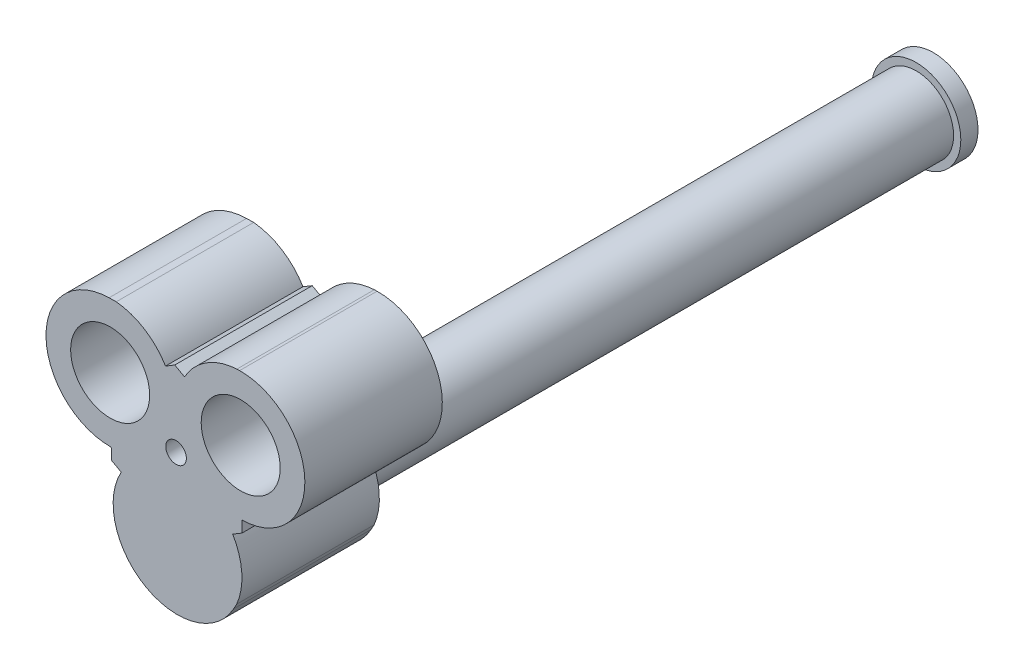
ISO-10303-21;
HEADER;
FILE_DESCRIPTION(('STEP AP214'),'2;1');
FILE_NAME('part.step','',(''),(''),'','','');
FILE_SCHEMA(('AUTOMOTIVE_DESIGN { 1 0 10303 214 1 1 1 1 }'));
ENDSEC;
DATA;
#1=APPLICATION_CONTEXT('core data for automotive mechanical design processes');
#2=APPLICATION_PROTOCOL_DEFINITION('international standard','automotive_design',2000,#1);
#3=PRODUCT_CONTEXT('',#1,'mechanical');
#4=PRODUCT('Part','Part','',(#3));
#5=PRODUCT_RELATED_PRODUCT_CATEGORY('part','',(#4));
#6=PRODUCT_DEFINITION_FORMATION('','',#4);
#7=PRODUCT_DEFINITION_CONTEXT('part definition',#1,'design');
#8=PRODUCT_DEFINITION('design','',#6,#7);
#9=PRODUCT_DEFINITION_SHAPE('','',#8);
#10=(LENGTH_UNIT() NAMED_UNIT(*) SI_UNIT(.MILLI.,.METRE.));
#11=(NAMED_UNIT(*) PLANE_ANGLE_UNIT() SI_UNIT($,.RADIAN.));
#12=(NAMED_UNIT(*) SI_UNIT($,.STERADIAN.) SOLID_ANGLE_UNIT());
#13=UNCERTAINTY_MEASURE_WITH_UNIT(LENGTH_MEASURE(1.E-05),#10,'distance_accuracy_value','');
#14=(GEOMETRIC_REPRESENTATION_CONTEXT(3) GLOBAL_UNCERTAINTY_ASSIGNED_CONTEXT((#13)) GLOBAL_UNIT_ASSIGNED_CONTEXT((#10,
#11,#12)) REPRESENTATION_CONTEXT('',''));
#15=CARTESIAN_POINT('',(0.,0.,0.));
#16=DIRECTION('',(0.,0.,1.));
#17=DIRECTION('',(1.,0.,0.));
#18=AXIS2_PLACEMENT_3D('',#15,#16,#17);
#19=CARTESIAN_POINT('',(0.,0.,2.5));
#20=DIRECTION('',(0.,0.,1.));
#21=DIRECTION('',(1.,0.,0.));
#22=AXIS2_PLACEMENT_3D('',#19,#20,#21);
#23=CYLINDRICAL_SURFACE('',#22,5.45);
#24=CARTESIAN_POINT('',(0.,0.,2.5));
#25=DIRECTION('',(0.,0.,1.));
#26=DIRECTION('',(1.,0.,0.));
#27=AXIS2_PLACEMENT_3D('',#24,#25,#26);
#28=CIRCLE('',#27,5.45);
#29=CARTESIAN_POINT('',(5.45,0.,2.5));
#30=VERTEX_POINT('',#29);
#31=EDGE_CURVE('E231',#30,#30,#28,.T.);
#32=ORIENTED_EDGE('',*,*,#31,.T.);
#33=EDGE_LOOP('',(#32));
#34=FACE_BOUND('',#33,.T.);
#35=CARTESIAN_POINT('',(0.,0.,100.));
#36=DIRECTION('',(0.,0.,1.));
#37=DIRECTION('',(1.,0.,0.));
#38=AXIS2_PLACEMENT_3D('',#35,#36,#37);
#39=CIRCLE('',#38,5.45);
#40=CARTESIAN_POINT('',(5.45,0.,100.));
#41=VERTEX_POINT('',#40);
#42=EDGE_CURVE('E59',#41,#41,#39,.F.);
#43=ORIENTED_EDGE('',*,*,#42,.T.);
#44=EDGE_LOOP('',(#43));
#45=FACE_BOUND('',#44,.T.);
#46=ADVANCED_FACE('F55',(#34,#45),#23,.T.);
#47=CARTESIAN_POINT('',(0.,0.,110.));
#48=DIRECTION('',(0.,0.,-1.));
#49=DIRECTION('',(-1.,0.,0.));
#50=AXIS2_PLACEMENT_3D('',#47,#48,#49);
#51=CYLINDRICAL_SURFACE('',#50,6.5);
#52=CARTESIAN_POINT('',(0.,0.,0.));
#53=DIRECTION('',(0.,0.,1.));
#54=DIRECTION('',(1.,0.,0.));
#55=AXIS2_PLACEMENT_3D('',#52,#53,#54);
#56=CIRCLE('',#55,6.5);
#57=CARTESIAN_POINT('',(6.5,0.,0.));
#58=VERTEX_POINT('',#57);
#59=EDGE_CURVE('E66',#58,#58,#56,.T.);
#60=ORIENTED_EDGE('',*,*,#59,.T.);
#61=EDGE_LOOP('',(#60));
#62=FACE_BOUND('',#61,.T.);
#63=CARTESIAN_POINT('',(0.,0.,2.5));
#64=DIRECTION('',(0.,0.,1.));
#65=DIRECTION('',(1.,0.,0.));
#66=AXIS2_PLACEMENT_3D('',#63,#64,#65);
#67=CIRCLE('',#66,6.5);
#68=CARTESIAN_POINT('',(6.5,0.,2.5));
#69=VERTEX_POINT('',#68);
#70=EDGE_CURVE('E235',#69,#69,#67,.T.);
#71=ORIENTED_EDGE('',*,*,#70,.F.);
#72=EDGE_LOOP('',(#71));
#73=FACE_BOUND('',#72,.T.);
#74=ADVANCED_FACE('F57',(#62,#73),#51,.T.);
#75=CARTESIAN_POINT('',(0.,0.,0.));
#76=DIRECTION('',(0.,0.,1.));
#77=DIRECTION('',(1.,0.,0.));
#78=AXIS2_PLACEMENT_3D('',#75,#76,#77);
#79=PLANE('',#78);
#80=CARTESIAN_POINT('',(0.,0.,0.));
#81=DIRECTION('',(0.,0.,-1.));
#82=DIRECTION('',(-1.,0.,0.));
#83=AXIS2_PLACEMENT_3D('',#80,#81,#82);
#84=CIRCLE('',#83,2.5);
#85=CARTESIAN_POINT('',(-2.5,0.,0.));
#86=VERTEX_POINT('',#85);
#87=EDGE_CURVE('E13',#86,#86,#84,.T.);
#88=ORIENTED_EDGE('',*,*,#87,.F.);
#89=EDGE_LOOP('',(#88));
#90=FACE_BOUND('',#89,.T.);
#91=ORIENTED_EDGE('',*,*,#59,.F.);
#92=EDGE_LOOP('',(#91));
#93=FACE_BOUND('',#92,.T.);
#94=ADVANCED_FACE('F249',(#90,#93),#79,.F.);
#95=CARTESIAN_POINT('',(0.,0.,-2.5));
#96=DIRECTION('',(0.,0.,1.));
#97=DIRECTION('',(1.,0.,0.));
#98=AXIS2_PLACEMENT_3D('',#95,#96,#97);
#99=CYLINDRICAL_SURFACE('',#98,2.5);
#100=CARTESIAN_POINT('',(0.,0.,-2.5));
#101=DIRECTION('',(0.,0.,-1.));
#102=DIRECTION('',(-1.,0.,0.));
#103=AXIS2_PLACEMENT_3D('',#100,#101,#102);
#104=CIRCLE('',#103,2.5);
#105=CARTESIAN_POINT('',(-2.5,0.,-2.5));
#106=VERTEX_POINT('',#105);
#107=EDGE_CURVE('E236',#106,#106,#104,.T.);
#108=ORIENTED_EDGE('',*,*,#107,.F.);
#109=EDGE_LOOP('',(#108));
#110=FACE_BOUND('',#109,.T.);
#111=ORIENTED_EDGE('',*,*,#87,.T.);
#112=EDGE_LOOP('',(#111));
#113=FACE_BOUND('',#112,.T.);
#114=ADVANCED_FACE('F255',(#110,#113),#99,.T.);
#115=CARTESIAN_POINT('',(0.,0.,-2.5));
#116=DIRECTION('',(0.,0.,-1.));
#117=DIRECTION('',(-1.,0.,0.));
#118=AXIS2_PLACEMENT_3D('',#115,#116,#117);
#119=PLANE('',#118);
#120=ORIENTED_EDGE('',*,*,#107,.T.);
#121=EDGE_LOOP('',(#120));
#122=FACE_BOUND('',#121,.T.);
#123=ADVANCED_FACE('F270',(#122),#119,.T.);
#124=CARTESIAN_POINT('',(0.,0.,2.5));
#125=DIRECTION('',(0.,0.,1.));
#126=DIRECTION('',(1.,0.,0.));
#127=AXIS2_PLACEMENT_3D('',#124,#125,#126);
#128=PLANE('',#127);
#129=ORIENTED_EDGE('',*,*,#31,.F.);
#130=EDGE_LOOP('',(#129));
#131=FACE_BOUND('',#130,.T.);
#132=ORIENTED_EDGE('',*,*,#70,.T.);
#133=EDGE_LOOP('',(#132));
#134=FACE_BOUND('',#133,.T.);
#135=ADVANCED_FACE('F246',(#131,#134),#128,.T.);
#136=CARTESIAN_POINT('',(0.,0.,100.));
#137=DIRECTION('',(0.,0.,1.));
#138=DIRECTION('',(1.,0.,0.));
#139=AXIS2_PLACEMENT_3D('',#136,#137,#138);
#140=PLANE('',#139);
#141=ORIENTED_EDGE('',*,*,#42,.F.);
#142=EDGE_LOOP('',(#141));
#143=FACE_BOUND('',#142,.T.);
#144=CARTESIAN_POINT('',(0.,0.,100.));
#145=DIRECTION('',(0.,0.,1.));
#146=DIRECTION('',(1.,0.,0.));
#147=AXIS2_PLACEMENT_3D('',#144,#145,#146);
#148=CIRCLE('',#147,5.75);
#149=CARTESIAN_POINT('',(5.75,0.,100.));
#150=VERTEX_POINT('',#149);
#151=EDGE_CURVE('E226',#150,#150,#148,.T.);
#152=ORIENTED_EDGE('',*,*,#151,.F.);
#153=EDGE_LOOP('',(#152));
#154=FACE_BOUND('',#153,.T.);
#155=ADVANCED_FACE('F266',(#143,#154),#140,.F.);
#156=CARTESIAN_POINT('',(0.,0.,140.));
#157=DIRECTION('',(0.,0.,-1.));
#158=DIRECTION('',(-0.999990132765997,-0.00444233842065457,0.));
#159=AXIS2_PLACEMENT_3D('',#156,#157,#158);
#160=CYLINDRICAL_SURFACE('',#159,5.75);
#161=CARTESIAN_POINT('',(0.,0.,90.));
#162=DIRECTION('',(0.,0.,-1.));
#163=DIRECTION('',(-0.999990132765997,-0.00444233842065457,0.));
#164=AXIS2_PLACEMENT_3D('',#161,#162,#163);
#165=CIRCLE('',#164,5.75);
#166=CARTESIAN_POINT('',(-5.7499432634045,-0.025543445918847,90.));
#167=VERTEX_POINT('',#166);
#168=EDGE_CURVE('E333',#167,#167,#165,.T.);
#169=ORIENTED_EDGE('',*,*,#168,.T.);
#170=EDGE_LOOP('',(#169));
#171=FACE_BOUND('',#170,.T.);
#172=ORIENTED_EDGE('',*,*,#151,.T.);
#173=EDGE_LOOP('',(#172));
#174=FACE_BOUND('',#173,.T.);
#175=ADVANCED_FACE('F505',(#171,#174),#160,.F.);
#176=CARTESIAN_POINT('',(-0.187584514168837,11.0074735096585,90.));
#177=DIRECTION('',(0.,0.,-1.));
#178=DIRECTION('',(-0.999990132765997,-0.00444233842065457,0.));
#179=AXIS2_PLACEMENT_3D('',#176,#177,#178);
#180=PLANE('',#179);
#181=CARTESIAN_POINT('',(-0.187584514168837,11.0074735096585,90.));
#182=DIRECTION('',(0.,0.,-1.));
#183=DIRECTION('',(-0.999990132765997,-0.00444233842065457,0.));
#184=AXIS2_PLACEMENT_3D('',#181,#182,#183);
#185=CIRCLE('',#184,1.5);
#186=CARTESIAN_POINT('',(-1.68756971331783,11.0008100020275,90.));
#187=VERTEX_POINT('',#186);
#188=EDGE_CURVE('E320',#187,#187,#185,.T.);
#189=ORIENTED_EDGE('',*,*,#188,.F.);
#190=EDGE_LOOP('',(#189));
#191=FACE_BOUND('',#190,.T.);
#192=CARTESIAN_POINT('',(9.21825149446411,16.6139651915131,90.));
#193=DIRECTION('',(0.,0.,-1.));
#194=DIRECTION('',(-0.999990132765997,-0.00444233842065457,0.));
#195=AXIS2_PLACEMENT_3D('',#192,#193,#194);
#196=CIRCLE('',#195,5.75000000000001);
#197=CARTESIAN_POINT('',(3.46830823105961,16.5884217455943,90.));
#198=VERTEX_POINT('',#197);
#199=EDGE_CURVE('E374',#198,#198,#196,.T.);
#200=ORIENTED_EDGE('',*,*,#199,.F.);
#201=EDGE_LOOP('',(#200));
#202=FACE_BOUND('',#201,.T.);
#203=CARTESIAN_POINT('',(-9.77899016620873,16.2902225684363,90.));
#204=DIRECTION('',(0.,0.,-1.));
#205=DIRECTION('',(-0.999990132765997,-0.00444233842065457,0.));
#206=AXIS2_PLACEMENT_3D('',#203,#204,#205);
#207=CIRCLE('',#206,5.75);
#208=CARTESIAN_POINT('',(-15.5289334296132,16.2646791225175,90.));
#209=VERTEX_POINT('',#208);
#210=EDGE_CURVE('E380',#209,#209,#207,.T.);
#211=ORIENTED_EDGE('',*,*,#210,.F.);
#212=EDGE_LOOP('',(#211));
#213=FACE_BOUND('',#212,.T.);
#214=ORIENTED_EDGE('',*,*,#168,.F.);
#215=EDGE_LOOP('',(#214));
#216=FACE_BOUND('',#215,.T.);
#217=DIRECTION('',(-0.857380135180861,-0.514683692958353,0.));
#218=VECTOR('',#217,1.);
#219=CARTESIAN_POINT('',(16.6276425636652,9.98154275880603,90.));
#220=LINE('',#219,#218);
#221=CARTESIAN_POINT('',(9.40516438504563,5.64590260486321,90.));
#222=VERTEX_POINT('',#221);
#223=CARTESIAN_POINT('',(8.05384121185663,4.8347058292225,90.));
#224=VERTEX_POINT('',#223);
#225=EDGE_CURVE('E433',#222,#224,#220,.T.);
#226=ORIENTED_EDGE('',*,*,#225,.T.);
#227=CARTESIAN_POINT('',(0.,0.,90.));
#228=DIRECTION('',(0.,0.,-1.));
#229=DIRECTION('',(-0.999990132765997,-0.00444233842065457,0.));
#230=AXIS2_PLACEMENT_3D('',#227,#228,#229);
#231=CIRCLE('',#230,9.3935477174984);
#232=CARTESIAN_POINT('',(8.63896069997515,-3.68877984504425,90.));
#233=VERTEX_POINT('',#232);
#234=EDGE_CURVE('E218',#224,#233,#231,.T.);
#235=ORIENTED_EDGE('',*,*,#234,.T.);
#236=DIRECTION('',(-0.485171131287585,-0.874419220605955,0.));
#237=VECTOR('',#236,1.);
#238=CARTESIAN_POINT('',(8.17036576115139,-4.53332395486946,90.));
#239=LINE('',#238,#237);
#240=CARTESIAN_POINT('',(8.17036576115139,-4.53332395486946,90.));
#241=VERTEX_POINT('',#240);
#242=EDGE_CURVE('E213',#233,#241,#239,.T.);
#243=ORIENTED_EDGE('',*,*,#242,.T.);
#244=CARTESIAN_POINT('',(0.,0.,90.));
#245=DIRECTION('',(0.,0.,-1.));
#246=DIRECTION('',(-0.999990132765997,-0.00444233842065457,0.));
#247=AXIS2_PLACEMENT_3D('',#244,#245,#246);
#248=CIRCLE('',#247,9.34376277260867);
#249=CARTESIAN_POINT('',(-8.17036576115142,4.53332395486929,90.));
#250=VERTEX_POINT('',#249);
#251=EDGE_CURVE('E217',#241,#250,#248,.T.);
#252=ORIENTED_EDGE('',*,*,#251,.T.);
#253=DIRECTION('',(-0.874419220605955,0.485171131287585,0.));
#254=VECTOR('',#253,1.);
#255=CARTESIAN_POINT('',(-8.17036576115142,4.53332395486929,90.));
#256=LINE('',#255,#254);
#257=CARTESIAN_POINT('',(-9.5920772756272,5.32215998178645,90.));
#258=VERTEX_POINT('',#257);
#259=EDGE_CURVE('E222',#250,#258,#256,.T.);
#260=ORIENTED_EDGE('',*,*,#259,.T.);
#261=DIRECTION('',(-0.0170390854250929,0.999854824245939,0.));
#262=VECTOR('',#261,1.);
#263=CARTESIAN_POINT('',(-9.44953421128947,-3.04227783780403,90.));
#264=LINE('',#263,#262);
#265=CARTESIAN_POINT('',(-9.6199250655404,6.95627040465536,90.));
#266=VERTEX_POINT('',#265);
#267=EDGE_CURVE('E192',#258,#266,#264,.T.);
#268=ORIENTED_EDGE('',*,*,#267,.T.);
#269=CARTESIAN_POINT('',(-9.77899016620873,16.2902225684363,90.));
#270=DIRECTION('',(0.,0.,-1.));
#271=DIRECTION('',(-0.999990132765997,-0.00444233842065457,0.));
#272=AXIS2_PLACEMENT_3D('',#269,#270,#271);
#273=CIRCLE('',#272,9.33530742407561);
#274=CARTESIAN_POINT('',(-9.93805526687705,25.6241747322172,90.));
#275=VERTEX_POINT('',#274);
#276=EDGE_CURVE('E187',#266,#275,#273,.T.);
#277=ORIENTED_EDGE('',*,*,#276,.T.);
#278=DIRECTION('',(0.999854824245939,0.0170390854250931,0.));
#279=VECTOR('',#278,1.);
#280=CARTESIAN_POINT('',(9.05918639379577,25.947917355294,90.));
#281=LINE('',#280,#279);
#282=CARTESIAN_POINT('',(-8.89380561567961,25.6419703747249,90.));
#283=VERTEX_POINT('',#282);
#284=EDGE_CURVE('E164',#275,#283,#281,.T.);
#285=ORIENTED_EDGE('',*,*,#284,.T.);
#286=CARTESIAN_POINT('',(-9.77899016620873,16.2902225684363,90.));
#287=DIRECTION('',(0.,0.,-1.));
#288=DIRECTION('',(-0.999990132765997,-0.00444233842065457,0.));
#289=AXIS2_PLACEMENT_3D('',#286,#287,#288);
#290=CIRCLE('',#289,9.3935477174984);
#291=CARTESIAN_POINT('',(-1.72514895435207,21.1249283976589,90.));
#292=VERTEX_POINT('',#291);
#293=EDGE_CURVE('E174',#283,#292,#290,.T.);
#294=ORIENTED_EDGE('',*,*,#293,.T.);
#295=DIRECTION('',(0.857380135180862,0.514683692958352,0.));
#296=VECTOR('',#295,1.);
#297=CARTESIAN_POINT('',(-1.72514895435207,21.1249283976589,90.));
#298=LINE('',#297,#296);
#299=CARTESIAN_POINT('',(-0.373825781163064,21.9361251732996,90.));
#300=VERTEX_POINT('',#299);
#301=EDGE_CURVE('E182',#292,#300,#298,.T.);
#302=ORIENTED_EDGE('',*,*,#301,.T.);
#303=DIRECTION('',(0.874419220605955,-0.485171131287584,0.));
#304=VECTOR('',#303,1.);
#305=CARTESIAN_POINT('',(-7.69630647274685,25.9990004592583,90.));
#306=LINE('',#305,#304);
#307=CARTESIAN_POINT('',(1.0478857333127,21.1472891463824,90.));
#308=VERTEX_POINT('',#307);
#309=EDGE_CURVE('E205',#300,#308,#306,.T.);
#310=ORIENTED_EDGE('',*,*,#309,.T.);
#311=CARTESIAN_POINT('',(9.2182514944641,16.613965191513,90.));
#312=DIRECTION('',(0.,0.,-1.));
#313=DIRECTION('',(-0.999990132765997,-0.00444233842065457,0.));
#314=AXIS2_PLACEMENT_3D('',#311,#312,#313);
#315=CIRCLE('',#314,9.34376277260867);
#316=CARTESIAN_POINT('',(8.66182988565164,25.941145780739,90.));
#317=VERTEX_POINT('',#316);
#318=EDGE_CURVE('E198',#308,#317,#315,.T.);
#319=ORIENTED_EDGE('',*,*,#318,.T.);
#320=CARTESIAN_POINT('',(9.05918639379577,25.947917355294,90.));
#321=VERTEX_POINT('',#320);
#322=EDGE_CURVE('E190',#317,#321,#281,.T.);
#323=ORIENTED_EDGE('',*,*,#322,.T.);
#324=CARTESIAN_POINT('',(9.2182514944641,16.613965191513,90.));
#325=DIRECTION('',(0.,0.,-1.));
#326=DIRECTION('',(-0.999990132765997,-0.00444233842065457,0.));
#327=AXIS2_PLACEMENT_3D('',#324,#325,#326);
#328=CIRCLE('',#327,9.33530742407561);
#329=CARTESIAN_POINT('',(9.37731659513243,7.28001302773213,90.));
#330=VERTEX_POINT('',#329);
#331=EDGE_CURVE('E197',#321,#330,#328,.T.);
#332=ORIENTED_EDGE('',*,*,#331,.T.);
#333=DIRECTION('',(0.0170390854250929,-0.999854824245939,0.));
#334=VECTOR('',#333,1.);
#335=CARTESIAN_POINT('',(9.37731659513243,7.28001302773213,90.));
#336=LINE('',#335,#334);
#337=EDGE_CURVE('E204',#330,#222,#336,.T.);
#338=ORIENTED_EDGE('',*,*,#337,.T.);
#339=EDGE_LOOP('',(#226,#235,#243,#252,#260,#268,#277,#285,#294,#302,#310,#319,#323,#332,#338));
#340=FACE_BOUND('',#339,.T.);
#341=ADVANCED_FACE('F185',(#191,#202,#213,#216,#340),#180,.T.);
#342=CARTESIAN_POINT('',(9.21825149446411,16.6139651915131,140.));
#343=DIRECTION('',(0.,0.,-1.));
#344=DIRECTION('',(-0.999990132765997,-0.00444233842065457,0.));
#345=AXIS2_PLACEMENT_3D('',#342,#343,#344);
#346=CYLINDRICAL_SURFACE('',#345,5.75000000000001);
#347=ORIENTED_EDGE('',*,*,#199,.T.);
#348=EDGE_LOOP('',(#347));
#349=FACE_BOUND('',#348,.T.);
#350=CARTESIAN_POINT('',(9.21825149446411,16.6139651915131,110.));
#351=DIRECTION('',(0.,0.,-1.));
#352=DIRECTION('',(-0.999990132765997,-0.00444233842065457,0.));
#353=AXIS2_PLACEMENT_3D('',#350,#351,#352);
#354=CIRCLE('',#353,5.75000000000001);
#355=CARTESIAN_POINT('',(3.46830823105961,16.5884217455943,110.));
#356=VERTEX_POINT('',#355);
#357=EDGE_CURVE('E295',#356,#356,#354,.T.);
#358=ORIENTED_EDGE('',*,*,#357,.F.);
#359=EDGE_LOOP('',(#358));
#360=FACE_BOUND('',#359,.T.);
#361=ADVANCED_FACE('F504',(#349,#360),#346,.F.);
#362=CARTESIAN_POINT('',(-9.77899016620873,16.2902225684363,140.));
#363=DIRECTION('',(0.,0.,-1.));
#364=DIRECTION('',(-0.999990132765997,-0.00444233842065457,0.));
#365=AXIS2_PLACEMENT_3D('',#362,#363,#364);
#366=CYLINDRICAL_SURFACE('',#365,5.75);
#367=ORIENTED_EDGE('',*,*,#210,.T.);
#368=EDGE_LOOP('',(#367));
#369=FACE_BOUND('',#368,.T.);
#370=CARTESIAN_POINT('',(-9.77899016620873,16.2902225684363,110.));
#371=DIRECTION('',(0.,0.,-1.));
#372=DIRECTION('',(-0.999990132765997,-0.00444233842065457,0.));
#373=AXIS2_PLACEMENT_3D('',#370,#371,#372);
#374=CIRCLE('',#373,5.75);
#375=CARTESIAN_POINT('',(-15.5289334296132,16.2646791225175,110.));
#376=VERTEX_POINT('',#375);
#377=EDGE_CURVE('E299',#376,#376,#374,.T.);
#378=ORIENTED_EDGE('',*,*,#377,.F.);
#379=EDGE_LOOP('',(#378));
#380=FACE_BOUND('',#379,.T.);
#381=ADVANCED_FACE('F494',(#369,#380),#366,.F.);
#382=CARTESIAN_POINT('',(-8.17036576115142,4.53332395486929,140.));
#383=DIRECTION('',(-0.485171131287585,-0.874419220605955,0.));
#384=DIRECTION('',(-0.874419220605955,0.485171131287585,0.));
#385=AXIS2_PLACEMENT_3D('',#382,#383,#384);
#386=PLANE('',#385);
#387=DIRECTION('',(-0.874419220605955,0.485171131287585,0.));
#388=VECTOR('',#387,1.);
#389=CARTESIAN_POINT('',(-4.81327197396652,2.67064190010119,110.));
#390=LINE('',#389,#388);
#391=CARTESIAN_POINT('',(-8.17036576115142,4.53332395486929,110.));
#392=VERTEX_POINT('',#391);
#393=CARTESIAN_POINT('',(-9.5920772756272,5.32215998178644,110.));
#394=VERTEX_POINT('',#393);
#395=EDGE_CURVE('E328',#392,#394,#390,.T.);
#396=ORIENTED_EDGE('',*,*,#395,.T.);
#397=DIRECTION('',(0.,0.,1.));
#398=VECTOR('',#397,1.);
#399=CARTESIAN_POINT('',(-9.5920772756272,5.32215998178644,140.));
#400=LINE('',#399,#398);
#401=EDGE_CURVE('E230',#258,#394,#400,.T.);
#402=ORIENTED_EDGE('',*,*,#401,.F.);
#403=ORIENTED_EDGE('',*,*,#259,.F.);
#404=DIRECTION('',(0.,0.,-1.));
#405=VECTOR('',#404,1.);
#406=CARTESIAN_POINT('',(-8.17036576115142,4.53332395486929,140.));
#407=LINE('',#406,#405);
#408=EDGE_CURVE('E324',#392,#250,#407,.T.);
#409=ORIENTED_EDGE('',*,*,#408,.F.);
#410=EDGE_LOOP('',(#396,#402,#403,#409));
#411=FACE_BOUND('',#410,.T.);
#412=ADVANCED_FACE('F490',(#411),#386,.T.);
#413=CARTESIAN_POINT('',(0.,0.,140.));
#414=DIRECTION('',(0.,0.,-1.));
#415=DIRECTION('',(-0.999990132765997,-0.00444233842065457,0.));
#416=AXIS2_PLACEMENT_3D('',#413,#414,#415);
#417=CYLINDRICAL_SURFACE('',#416,9.34376277260867);
#418=CARTESIAN_POINT('',(0.,0.,110.));
#419=DIRECTION('',(0.,0.,-1.));
#420=DIRECTION('',(-0.999990132765997,-0.00444233842065457,0.));
#421=AXIS2_PLACEMENT_3D('',#418,#419,#420);
#422=CIRCLE('',#421,9.34376277260867);
#423=CARTESIAN_POINT('',(8.17036576115139,-4.53332395486946,110.));
#424=VERTEX_POINT('',#423);
#425=EDGE_CURVE('E325',#424,#392,#422,.T.);
#426=ORIENTED_EDGE('',*,*,#425,.T.);
#427=ORIENTED_EDGE('',*,*,#408,.T.);
#428=ORIENTED_EDGE('',*,*,#251,.F.);
#429=DIRECTION('',(0.,0.,-1.));
#430=VECTOR('',#429,1.);
#431=CARTESIAN_POINT('',(8.17036576115139,-4.53332395486946,140.));
#432=LINE('',#431,#430);
#433=EDGE_CURVE('E120',#424,#241,#432,.T.);
#434=ORIENTED_EDGE('',*,*,#433,.F.);
#435=EDGE_LOOP('',(#426,#427,#428,#434));
#436=FACE_BOUND('',#435,.T.);
#437=ADVANCED_FACE('F493',(#436),#417,.T.);
#438=CARTESIAN_POINT('',(8.17036576115139,-4.53332395486946,140.));
#439=DIRECTION('',(0.874419220605955,-0.485171131287585,0.));
#440=DIRECTION('',(-0.485171131287585,-0.874419220605955,0.));
#441=AXIS2_PLACEMENT_3D('',#438,#439,#440);
#442=PLANE('',#441);
#443=DIRECTION('',(-0.485171131287585,-0.874419220605955,0.));
#444=VECTOR('',#443,1.);
#445=CARTESIAN_POINT('',(12.7960532209491,3.80350765468788,110.));
#446=LINE('',#445,#444);
#447=CARTESIAN_POINT('',(8.63896069997518,-3.68877984504418,110.));
#448=VERTEX_POINT('',#447);
#449=EDGE_CURVE('E127',#448,#424,#446,.T.);
#450=ORIENTED_EDGE('',*,*,#449,.T.);
#451=ORIENTED_EDGE('',*,*,#433,.T.);
#452=ORIENTED_EDGE('',*,*,#242,.F.);
#453=DIRECTION('',(0.,0.,-1.));
#454=VECTOR('',#453,1.);
#455=CARTESIAN_POINT('',(8.63896069997518,-3.68877984504418,140.));
#456=LINE('',#455,#454);
#457=EDGE_CURVE('E310',#448,#233,#456,.T.);
#458=ORIENTED_EDGE('',*,*,#457,.F.);
#459=EDGE_LOOP('',(#450,#451,#452,#458));
#460=FACE_BOUND('',#459,.T.);
#461=ADVANCED_FACE('F488',(#460),#442,.T.);
#462=CARTESIAN_POINT('',(16.6276425636652,9.98154275880603,140.));
#463=DIRECTION('',(0.514683692958353,-0.857380135180861,0.));
#464=DIRECTION('',(-0.857380135180861,-0.514683692958353,0.));
#465=AXIS2_PLACEMENT_3D('',#462,#463,#464);
#466=PLANE('',#465);
#467=DIRECTION('',(-0.857380135180861,-0.514683692958353,0.));
#468=VECTOR('',#467,1.);
#469=CARTESIAN_POINT('',(4.71947971688209,2.83309485472795,110.));
#470=LINE('',#469,#468);
#471=CARTESIAN_POINT('',(9.40516438504563,5.64590260486321,110.));
#472=VERTEX_POINT('',#471);
#473=CARTESIAN_POINT('',(8.05384121185663,4.8347058292225,110.));
#474=VERTEX_POINT('',#473);
#475=EDGE_CURVE('E305',#472,#474,#470,.T.);
#476=ORIENTED_EDGE('',*,*,#475,.T.);
#477=DIRECTION('',(0.,0.,-1.));
#478=VECTOR('',#477,1.);
#479=CARTESIAN_POINT('',(8.05384121185663,4.8347058292225,140.));
#480=LINE('',#479,#478);
#481=EDGE_CURVE('E311',#474,#224,#480,.T.);
#482=ORIENTED_EDGE('',*,*,#481,.T.);
#483=ORIENTED_EDGE('',*,*,#225,.F.);
#484=DIRECTION('',(0.,0.,-1.));
#485=VECTOR('',#484,1.);
#486=CARTESIAN_POINT('',(9.40516438504563,5.64590260486321,140.));
#487=LINE('',#486,#485);
#488=EDGE_CURVE('E339',#472,#222,#487,.T.);
#489=ORIENTED_EDGE('',*,*,#488,.F.);
#490=EDGE_LOOP('',(#476,#482,#483,#489));
#491=FACE_BOUND('',#490,.T.);
#492=ADVANCED_FACE('F485',(#491),#466,.T.);
#493=CARTESIAN_POINT('',(0.,0.,140.));
#494=DIRECTION('',(0.,0.,-1.));
#495=DIRECTION('',(-0.999990132765997,-0.00444233842065457,0.));
#496=AXIS2_PLACEMENT_3D('',#493,#494,#495);
#497=CYLINDRICAL_SURFACE('',#496,9.3935477174984);
#498=CARTESIAN_POINT('',(0.,0.,110.));
#499=DIRECTION('',(0.,0.,-1.));
#500=DIRECTION('',(-0.999990132765997,-0.00444233842065457,0.));
#501=AXIS2_PLACEMENT_3D('',#498,#499,#500);
#502=CIRCLE('',#501,9.3935477174984);
#503=EDGE_CURVE('E303',#474,#448,#502,.T.);
#504=ORIENTED_EDGE('',*,*,#503,.T.);
#505=ORIENTED_EDGE('',*,*,#457,.T.);
#506=ORIENTED_EDGE('',*,*,#234,.F.);
#507=ORIENTED_EDGE('',*,*,#481,.F.);
#508=EDGE_LOOP('',(#504,#505,#506,#507));
#509=FACE_BOUND('',#508,.T.);
#510=ADVANCED_FACE('F482',(#509),#497,.T.);
#511=CARTESIAN_POINT('',(9.2182514944641,16.613965191513,140.));
#512=DIRECTION('',(0.,0.,-1.));
#513=DIRECTION('',(-0.999990132765997,-0.00444233842065457,0.));
#514=AXIS2_PLACEMENT_3D('',#511,#512,#513);
#515=CYLINDRICAL_SURFACE('',#514,9.33530742407561);
#516=CARTESIAN_POINT('',(9.2182514944641,16.613965191513,110.));
#517=DIRECTION('',(0.,0.,-1.));
#518=DIRECTION('',(-0.999990132765997,-0.00444233842065457,0.));
#519=AXIS2_PLACEMENT_3D('',#516,#517,#518);
#520=CIRCLE('',#519,9.33530742407561);
#521=CARTESIAN_POINT('',(9.05918639379577,25.947917355294,110.));
#522=VERTEX_POINT('',#521);
#523=CARTESIAN_POINT('',(9.37731659513243,7.28001302773213,110.));
#524=VERTEX_POINT('',#523);
#525=EDGE_CURVE('E315',#522,#524,#520,.T.);
#526=ORIENTED_EDGE('',*,*,#525,.T.);
#527=DIRECTION('',(0.,0.,-1.));
#528=VECTOR('',#527,1.);
#529=CARTESIAN_POINT('',(9.37731659513243,7.28001302773213,140.));
#530=LINE('',#529,#528);
#531=EDGE_CURVE('E340',#524,#330,#530,.T.);
#532=ORIENTED_EDGE('',*,*,#531,.T.);
#533=ORIENTED_EDGE('',*,*,#331,.F.);
#534=DIRECTION('',(0.,0.,-1.));
#535=VECTOR('',#534,1.);
#536=CARTESIAN_POINT('',(9.05918639379577,25.947917355294,140.));
#537=LINE('',#536,#535);
#538=EDGE_CURVE('E356',#522,#321,#537,.T.);
#539=ORIENTED_EDGE('',*,*,#538,.F.);
#540=EDGE_LOOP('',(#526,#532,#533,#539));
#541=FACE_BOUND('',#540,.T.);
#542=ADVANCED_FACE('F413',(#541),#515,.T.);
#543=CARTESIAN_POINT('',(9.37731659513243,7.28001302773213,140.));
#544=DIRECTION('',(0.999854824245939,0.0170390854250929,0.));
#545=DIRECTION('',(0.0170390854250929,-0.999854824245939,0.));
#546=AXIS2_PLACEMENT_3D('',#543,#544,#545);
#547=PLANE('',#546);
#548=DIRECTION('',(0.0170390854250929,-0.999854824245939,0.));
#549=VECTOR('',#548,1.);
#550=CARTESIAN_POINT('',(9.31103631616758,11.1693448211969,110.));
#551=LINE('',#550,#549);
#552=EDGE_CURVE('E336',#524,#472,#551,.T.);
#553=ORIENTED_EDGE('',*,*,#552,.T.);
#554=ORIENTED_EDGE('',*,*,#488,.T.);
#555=ORIENTED_EDGE('',*,*,#337,.F.);
#556=ORIENTED_EDGE('',*,*,#531,.F.);
#557=EDGE_LOOP('',(#553,#554,#555,#556));
#558=FACE_BOUND('',#557,.T.);
#559=ADVANCED_FACE('F418',(#558),#547,.T.);
#560=CARTESIAN_POINT('',(-7.69630647274685,25.9990004592583,140.));
#561=DIRECTION('',(0.485171131287584,0.874419220605955,0.));
#562=DIRECTION('',(0.874419220605955,-0.485171131287584,0.));
#563=AXIS2_PLACEMENT_3D('',#560,#561,#562);
#564=PLANE('',#563);
#565=DIRECTION('',(0.874419220605955,-0.485171131287584,0.));
#566=VECTOR('',#565,1.);
#567=CARTESIAN_POINT('',(4.40497952049759,19.2846070916143,110.));
#568=LINE('',#567,#566);
#569=CARTESIAN_POINT('',(-0.373825781163063,21.9361251732996,110.));
#570=VERTEX_POINT('',#569);
#571=CARTESIAN_POINT('',(1.0478857333127,21.1472891463824,110.));
#572=VERTEX_POINT('',#571);
#573=EDGE_CURVE('E369',#570,#572,#568,.T.);
#574=ORIENTED_EDGE('',*,*,#573,.T.);
#575=DIRECTION('',(0.,0.,-1.));
#576=VECTOR('',#575,1.);
#577=CARTESIAN_POINT('',(1.0478857333127,21.1472891463824,140.));
#578=LINE('',#577,#576);
#579=EDGE_CURVE('E368',#572,#308,#578,.T.);
#580=ORIENTED_EDGE('',*,*,#579,.T.);
#581=ORIENTED_EDGE('',*,*,#309,.F.);
#582=DIRECTION('',(0.,0.,-1.));
#583=VECTOR('',#582,1.);
#584=CARTESIAN_POINT('',(-0.373825781163066,21.9361251732996,140.));
#585=LINE('',#584,#583);
#586=EDGE_CURVE('E363',#570,#300,#585,.T.);
#587=ORIENTED_EDGE('',*,*,#586,.F.);
#588=EDGE_LOOP('',(#574,#580,#581,#587));
#589=FACE_BOUND('',#588,.T.);
#590=ADVANCED_FACE('F451',(#589),#564,.T.);
#591=CARTESIAN_POINT('',(-1.72514895435207,21.1249283976589,140.));
#592=DIRECTION('',(-0.514683692958352,0.857380135180862,0.));
#593=DIRECTION('',(0.857380135180862,0.514683692958352,0.));
#594=AXIS2_PLACEMENT_3D('',#591,#592,#593);
#595=PLANE('',#594);
#596=DIRECTION('',(0.857380135180862,0.514683692958352,0.));
#597=VECTOR('',#596,1.);
#598=CARTESIAN_POINT('',(-5.05951044932662,19.1233174231643,110.));
#599=LINE('',#598,#597);
#600=CARTESIAN_POINT('',(-1.72514895435207,21.1249283976589,110.));
#601=VERTEX_POINT('',#600);
#602=EDGE_CURVE('E364',#601,#570,#599,.T.);
#603=ORIENTED_EDGE('',*,*,#602,.T.);
#604=ORIENTED_EDGE('',*,*,#586,.T.);
#605=ORIENTED_EDGE('',*,*,#301,.F.);
#606=DIRECTION('',(0.,0.,-1.));
#607=VECTOR('',#606,1.);
#608=CARTESIAN_POINT('',(-1.72514895435207,21.1249283976589,140.));
#609=LINE('',#608,#607);
#610=EDGE_CURVE('E177',#601,#292,#609,.T.);
#611=ORIENTED_EDGE('',*,*,#610,.F.);
#612=EDGE_LOOP('',(#603,#604,#605,#611));
#613=FACE_BOUND('',#612,.T.);
#614=ADVANCED_FACE('F458',(#613),#595,.T.);
#615=CARTESIAN_POINT('',(9.2182514944641,16.613965191513,140.));
#616=DIRECTION('',(0.,0.,-1.));
#617=DIRECTION('',(-0.999990132765997,-0.00444233842065457,0.));
#618=AXIS2_PLACEMENT_3D('',#615,#616,#617);
#619=CYLINDRICAL_SURFACE('',#618,9.34376277260867);
#620=CARTESIAN_POINT('',(9.2182514944641,16.613965191513,110.));
#621=DIRECTION('',(0.,0.,-1.));
#622=DIRECTION('',(-0.999990132765997,-0.00444233842065457,0.));
#623=AXIS2_PLACEMENT_3D('',#620,#621,#622);
#624=CIRCLE('',#623,9.34376277260867);
#625=CARTESIAN_POINT('',(8.6618298856516,25.941145780739,110.));
#626=VERTEX_POINT('',#625);
#627=EDGE_CURVE('E360',#572,#626,#624,.T.);
#628=ORIENTED_EDGE('',*,*,#627,.T.);
#629=DIRECTION('',(0.,0.,-1.));
#630=VECTOR('',#629,1.);
#631=CARTESIAN_POINT('',(8.6618298856516,25.941145780739,140.));
#632=LINE('',#631,#630);
#633=EDGE_CURVE('E346',#317,#626,#632,.F.);
#634=ORIENTED_EDGE('',*,*,#633,.F.);
#635=ORIENTED_EDGE('',*,*,#318,.F.);
#636=ORIENTED_EDGE('',*,*,#579,.F.);
#637=EDGE_LOOP('',(#628,#634,#635,#636));
#638=FACE_BOUND('',#637,.T.);
#639=ADVANCED_FACE('F460',(#638),#619,.T.);
#640=CARTESIAN_POINT('',(-9.77899016620873,16.2902225684363,140.));
#641=DIRECTION('',(0.,0.,-1.));
#642=DIRECTION('',(-0.999990132765997,-0.00444233842065457,0.));
#643=AXIS2_PLACEMENT_3D('',#640,#641,#642);
#644=CYLINDRICAL_SURFACE('',#643,9.3935477174984);
#645=CARTESIAN_POINT('',(-9.77899016620873,16.2902225684363,110.));
#646=DIRECTION('',(0.,0.,-1.));
#647=DIRECTION('',(-0.999990132765997,-0.00444233842065457,0.));
#648=AXIS2_PLACEMENT_3D('',#645,#646,#647);
#649=CIRCLE('',#648,9.3935477174984);
#650=CARTESIAN_POINT('',(-8.8938056156796,25.6419703747249,110.));
#651=VERTEX_POINT('',#650);
#652=EDGE_CURVE('E357',#651,#601,#649,.T.);
#653=ORIENTED_EDGE('',*,*,#652,.T.);
#654=ORIENTED_EDGE('',*,*,#610,.T.);
#655=ORIENTED_EDGE('',*,*,#293,.F.);
#656=DIRECTION('',(0.,0.,-1.));
#657=VECTOR('',#656,1.);
#658=CARTESIAN_POINT('',(-8.8938056156796,25.6419703747249,140.));
#659=LINE('',#658,#657);
#660=EDGE_CURVE('E159',#651,#283,#659,.T.);
#661=ORIENTED_EDGE('',*,*,#660,.F.);
#662=EDGE_LOOP('',(#653,#654,#655,#661));
#663=FACE_BOUND('',#662,.T.);
#664=ADVANCED_FACE('F175',(#663),#644,.T.);
#665=CARTESIAN_POINT('',(9.05918639379577,25.947917355294,140.));
#666=DIRECTION('',(-0.0170390854250931,0.999854824245939,0.));
#667=DIRECTION('',(0.999854824245939,0.0170390854250931,0.));
#668=AXIS2_PLACEMENT_3D('',#665,#666,#667);
#669=PLANE('',#668);
#670=DIRECTION('',(0.999854824245939,0.0170390854250931,0.));
#671=VECTOR('',#670,1.);
#672=CARTESIAN_POINT('',(-0.439434436540642,25.7860460437556,110.));
#673=LINE('',#672,#671);
#674=EDGE_CURVE('E352',#626,#522,#673,.T.);
#675=ORIENTED_EDGE('',*,*,#674,.T.);
#676=ORIENTED_EDGE('',*,*,#538,.T.);
#677=ORIENTED_EDGE('',*,*,#322,.F.);
#678=ORIENTED_EDGE('',*,*,#633,.T.);
#679=EDGE_LOOP('',(#675,#676,#677,#678));
#680=FACE_BOUND('',#679,.T.);
#681=ADVANCED_FACE('F462',(#680),#669,.T.);
#682=CARTESIAN_POINT('',(-9.77899016620873,16.2902225684363,140.));
#683=DIRECTION('',(0.,0.,-1.));
#684=DIRECTION('',(-0.999990132765997,-0.00444233842065457,0.));
#685=AXIS2_PLACEMENT_3D('',#682,#683,#684);
#686=CYLINDRICAL_SURFACE('',#685,9.33530742407561);
#687=CARTESIAN_POINT('',(-9.77899016620873,16.2902225684363,110.));
#688=DIRECTION('',(0.,0.,-1.));
#689=DIRECTION('',(-0.999990132765997,-0.00444233842065457,0.));
#690=AXIS2_PLACEMENT_3D('',#687,#688,#689);
#691=CIRCLE('',#690,9.33530742407561);
#692=CARTESIAN_POINT('',(-9.6199250655404,6.95627040465536,110.));
#693=VERTEX_POINT('',#692);
#694=CARTESIAN_POINT('',(-9.93805526687705,25.6241747322172,110.));
#695=VERTEX_POINT('',#694);
#696=EDGE_CURVE('E341',#693,#695,#691,.T.);
#697=ORIENTED_EDGE('',*,*,#696,.T.);
#698=DIRECTION('',(0.,0.,-1.));
#699=VECTOR('',#698,1.);
#700=CARTESIAN_POINT('',(-9.93805526687705,25.6241747322172,140.));
#701=LINE('',#700,#699);
#702=EDGE_CURVE('E345',#695,#275,#701,.T.);
#703=ORIENTED_EDGE('',*,*,#702,.T.);
#704=ORIENTED_EDGE('',*,*,#276,.F.);
#705=DIRECTION('',(0.,0.,-1.));
#706=VECTOR('',#705,1.);
#707=CARTESIAN_POINT('',(-9.6199250655404,6.95627040465536,140.));
#708=LINE('',#707,#706);
#709=EDGE_CURVE('E75',#693,#266,#708,.T.);
#710=ORIENTED_EDGE('',*,*,#709,.F.);
#711=EDGE_LOOP('',(#697,#703,#704,#710));
#712=FACE_BOUND('',#711,.T.);
#713=ADVANCED_FACE('F405',(#712),#686,.T.);
#714=DIRECTION('',(0.999854824245939,0.0170390854250931,0.));
#715=VECTOR('',#714,1.);
#716=CARTESIAN_POINT('',(-0.439434436540642,25.7860460437556,110.));
#717=LINE('',#716,#715);
#718=EDGE_CURVE('E167',#695,#651,#717,.T.);
#719=ORIENTED_EDGE('',*,*,#718,.T.);
#720=ORIENTED_EDGE('',*,*,#660,.T.);
#721=ORIENTED_EDGE('',*,*,#284,.F.);
#722=ORIENTED_EDGE('',*,*,#702,.F.);
#723=EDGE_LOOP('',(#719,#720,#721,#722));
#724=FACE_BOUND('',#723,.T.);
#725=ADVANCED_FACE('F161',(#724),#669,.T.);
#726=CARTESIAN_POINT('',(-9.44953421128947,-3.04227783780403,140.));
#727=DIRECTION('',(-0.999854824245939,-0.0170390854250929,0.));
#728=DIRECTION('',(-0.0170390854250929,0.999854824245939,0.));
#729=AXIS2_PLACEMENT_3D('',#726,#727,#728);
#730=PLANE('',#729);
#731=DIRECTION('',(-0.0170390854250929,0.999854824245939,0.));
#732=VECTOR('',#731,1.);
#733=CARTESIAN_POINT('',(-9.68620534450525,10.8456021981201,110.));
#734=LINE('',#733,#732);
#735=EDGE_CURVE('E171',#394,#693,#734,.T.);
#736=ORIENTED_EDGE('',*,*,#735,.T.);
#737=ORIENTED_EDGE('',*,*,#709,.T.);
#738=ORIENTED_EDGE('',*,*,#267,.F.);
#739=ORIENTED_EDGE('',*,*,#401,.T.);
#740=EDGE_LOOP('',(#736,#737,#738,#739));
#741=FACE_BOUND('',#740,.T.);
#742=ADVANCED_FACE('F285',(#741),#730,.T.);
#743=CARTESIAN_POINT('',(-0.187584514168837,11.0074735096585,110.));
#744=DIRECTION('',(0.,0.,-1.));
#745=DIRECTION('',(-0.999990132765997,-0.00444233842065457,0.));
#746=AXIS2_PLACEMENT_3D('',#743,#744,#745);
#747=CYLINDRICAL_SURFACE('',#746,1.5);
#748=CARTESIAN_POINT('',(-0.187584514168837,11.0074735096585,110.));
#749=DIRECTION('',(0.,0.,-1.));
#750=DIRECTION('',(-0.999990132765997,-0.00444233842065457,0.));
#751=AXIS2_PLACEMENT_3D('',#748,#749,#750);
#752=CIRCLE('',#751,1.5);
#753=CARTESIAN_POINT('',(-1.68756971331783,11.0008100020275,110.));
#754=VERTEX_POINT('',#753);
#755=EDGE_CURVE('E291',#754,#754,#752,.T.);
#756=ORIENTED_EDGE('',*,*,#755,.F.);
#757=EDGE_LOOP('',(#756));
#758=FACE_BOUND('',#757,.T.);
#759=ORIENTED_EDGE('',*,*,#188,.T.);
#760=EDGE_LOOP('',(#759));
#761=FACE_BOUND('',#760,.T.);
#762=ADVANCED_FACE('F280',(#758,#761),#747,.F.);
#763=CARTESIAN_POINT('',(0.,0.,110.));
#764=DIRECTION('',(0.,0.,1.));
#765=DIRECTION('',(1.,0.,0.));
#766=AXIS2_PLACEMENT_3D('',#763,#764,#765);
#767=PLANE('',#766);
#768=ORIENTED_EDGE('',*,*,#755,.T.);
#769=EDGE_LOOP('',(#768));
#770=FACE_BOUND('',#769,.T.);
#771=ORIENTED_EDGE('',*,*,#357,.T.);
#772=EDGE_LOOP('',(#771));
#773=FACE_BOUND('',#772,.T.);
#774=ORIENTED_EDGE('',*,*,#377,.T.);
#775=EDGE_LOOP('',(#774));
#776=FACE_BOUND('',#775,.T.);
#777=ORIENTED_EDGE('',*,*,#503,.F.);
#778=ORIENTED_EDGE('',*,*,#475,.F.);
#779=ORIENTED_EDGE('',*,*,#552,.F.);
#780=ORIENTED_EDGE('',*,*,#525,.F.);
#781=ORIENTED_EDGE('',*,*,#674,.F.);
#782=ORIENTED_EDGE('',*,*,#627,.F.);
#783=ORIENTED_EDGE('',*,*,#573,.F.);
#784=ORIENTED_EDGE('',*,*,#602,.F.);
#785=ORIENTED_EDGE('',*,*,#652,.F.);
#786=ORIENTED_EDGE('',*,*,#718,.F.);
#787=ORIENTED_EDGE('',*,*,#696,.F.);
#788=ORIENTED_EDGE('',*,*,#735,.F.);
#789=ORIENTED_EDGE('',*,*,#395,.F.);
#790=ORIENTED_EDGE('',*,*,#425,.F.);
#791=ORIENTED_EDGE('',*,*,#449,.F.);
#792=EDGE_LOOP('',(#777,#778,#779,#780,#781,#782,#783,#784,#785,#786,#787,#788,#789,#790,#791));
#793=FACE_BOUND('',#792,.T.);
#794=ADVANCED_FACE('F278',(#770,#773,#776,#793),#767,.T.);
#795=CLOSED_SHELL('',(#46,#74,#94,#114,#123,#135,#155,#175,#341,#361,#381,#412,#437,#461,#492,
#510,#542,#559,#590,#614,#639,#664,#681,#713,#725,#742,#762,#794));
#796=MANIFOLD_SOLID_BREP('B2',#795);
#797=ADVANCED_BREP_SHAPE_REPRESENTATION('',(#18,#796),#14);
#798=SHAPE_DEFINITION_REPRESENTATION(#9,#797);
ENDSEC;
END-ISO-10303-21;
